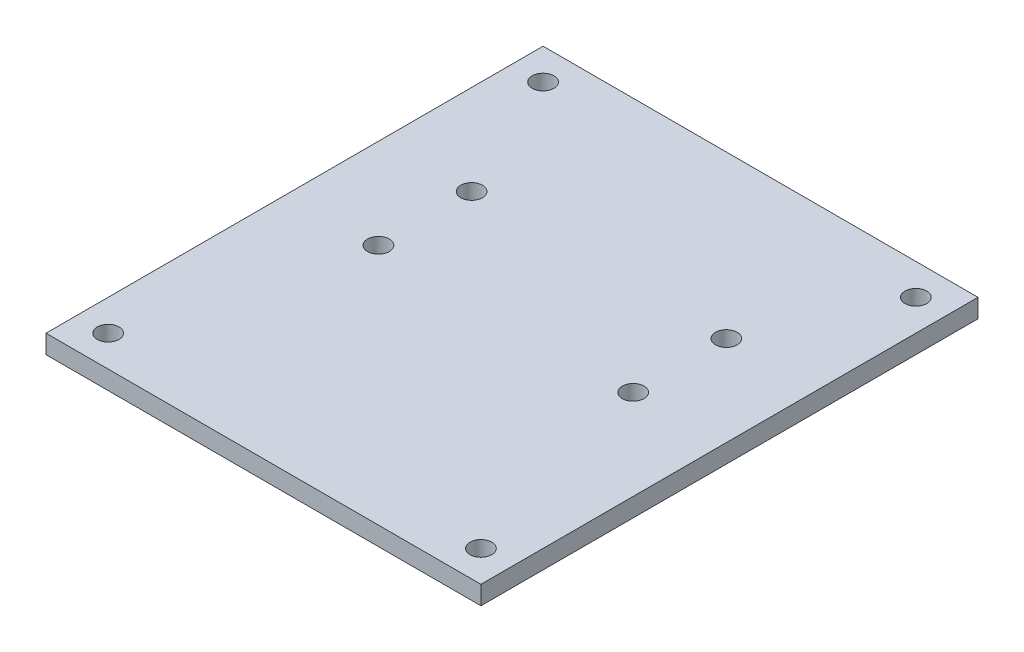
ISO-10303-21;
HEADER;
FILE_DESCRIPTION(('STEP AP214'),'2;1');
FILE_NAME('part.step','',(''),(''),'','','');
FILE_SCHEMA(('AUTOMOTIVE_DESIGN { 1 0 10303 214 1 1 1 1 }'));
ENDSEC;
DATA;
#1=APPLICATION_CONTEXT('core data for automotive mechanical design processes');
#2=APPLICATION_PROTOCOL_DEFINITION('international standard','automotive_design',2000,#1);
#3=PRODUCT_CONTEXT('',#1,'mechanical');
#4=PRODUCT('Part','Part','',(#3));
#5=PRODUCT_RELATED_PRODUCT_CATEGORY('part','',(#4));
#6=PRODUCT_DEFINITION_FORMATION('','',#4);
#7=PRODUCT_DEFINITION_CONTEXT('part definition',#1,'design');
#8=PRODUCT_DEFINITION('design','',#6,#7);
#9=PRODUCT_DEFINITION_SHAPE('','',#8);
#10=(LENGTH_UNIT() NAMED_UNIT(*) SI_UNIT(.MILLI.,.METRE.));
#11=(NAMED_UNIT(*) PLANE_ANGLE_UNIT() SI_UNIT($,.RADIAN.));
#12=(NAMED_UNIT(*) SI_UNIT($,.STERADIAN.) SOLID_ANGLE_UNIT());
#13=UNCERTAINTY_MEASURE_WITH_UNIT(LENGTH_MEASURE(1.E-05),#10,'distance_accuracy_value','');
#14=(GEOMETRIC_REPRESENTATION_CONTEXT(3) GLOBAL_UNCERTAINTY_ASSIGNED_CONTEXT((#13)) GLOBAL_UNIT_ASSIGNED_CONTEXT((#10,
#11,#12)) REPRESENTATION_CONTEXT('',''));
#15=CARTESIAN_POINT('',(0.,0.,0.));
#16=DIRECTION('',(0.,0.,1.));
#17=DIRECTION('',(1.,0.,0.));
#18=AXIS2_PLACEMENT_3D('',#15,#16,#17);
#19=CARTESIAN_POINT('',(0.,3.,0.));
#20=DIRECTION('',(0.,-1.,0.));
#21=DIRECTION('',(0.,0.,-1.));
#22=AXIS2_PLACEMENT_3D('',#19,#20,#21);
#23=PLANE('',#22);
#24=CARTESIAN_POINT('',(-30.0000000000001,3.,-28.5000000000004));
#25=DIRECTION('',(0.,1.,0.));
#26=DIRECTION('',(0.,0.,-1.));
#27=AXIS2_PLACEMENT_3D('',#24,#25,#26);
#28=CIRCLE('',#27,1.75000000000001);
#29=CARTESIAN_POINT('',(-30.0000000000001,3.,-30.2500000000004));
#30=VERTEX_POINT('',#29);
#31=EDGE_CURVE('E154',#30,#30,#28,.T.);
#32=ORIENTED_EDGE('',*,*,#31,.F.);
#33=EDGE_LOOP('',(#32));
#34=FACE_BOUND('',#33,.T.);
#35=CARTESIAN_POINT('',(30.,3.,41.5));
#36=DIRECTION('',(0.,1.,0.));
#37=DIRECTION('',(0.,0.,-1.));
#38=AXIS2_PLACEMENT_3D('',#35,#36,#37);
#39=CIRCLE('',#38,1.75000000000001);
#40=CARTESIAN_POINT('',(30.,3.,39.75));
#41=VERTEX_POINT('',#40);
#42=EDGE_CURVE('E147',#41,#41,#39,.T.);
#43=ORIENTED_EDGE('',*,*,#42,.F.);
#44=EDGE_LOOP('',(#43));
#45=FACE_BOUND('',#44,.T.);
#46=CARTESIAN_POINT('',(-30.0000000000001,3.,41.5000000000004));
#47=DIRECTION('',(0.,1.,0.));
#48=DIRECTION('',(0.,0.,1.));
#49=AXIS2_PLACEMENT_3D('',#46,#47,#48);
#50=CIRCLE('',#49,1.75000000000001);
#51=CARTESIAN_POINT('',(-30.0000000000001,3.,43.2500000000004));
#52=VERTEX_POINT('',#51);
#53=EDGE_CURVE('E159',#52,#52,#50,.T.);
#54=ORIENTED_EDGE('',*,*,#53,.F.);
#55=EDGE_LOOP('',(#54));
#56=FACE_BOUND('',#55,.T.);
#57=CARTESIAN_POINT('',(30.,3.,-28.5));
#58=DIRECTION('',(0.,1.,0.));
#59=DIRECTION('',(0.,0.,1.));
#60=AXIS2_PLACEMENT_3D('',#57,#58,#59);
#61=CIRCLE('',#60,1.75000000000001);
#62=CARTESIAN_POINT('',(30.,3.,-26.75));
#63=VERTEX_POINT('',#62);
#64=EDGE_CURVE('E141',#63,#63,#61,.T.);
#65=ORIENTED_EDGE('',*,*,#64,.F.);
#66=EDGE_LOOP('',(#65));
#67=FACE_BOUND('',#66,.T.);
#68=DIRECTION('',(0.,0.,-1.));
#69=VECTOR('',#68,1.);
#70=CARTESIAN_POINT('',(35.,3.,46.5));
#71=LINE('',#70,#69);
#72=CARTESIAN_POINT('',(35.,3.,46.5));
#73=VERTEX_POINT('',#72);
#74=CARTESIAN_POINT('',(35.,3.,-33.5));
#75=VERTEX_POINT('',#74);
#76=EDGE_CURVE('E90',#73,#75,#71,.T.);
#77=ORIENTED_EDGE('',*,*,#76,.T.);
#78=DIRECTION('',(-1.,0.,0.));
#79=VECTOR('',#78,1.);
#80=CARTESIAN_POINT('',(-35.,3.,-33.5));
#81=LINE('',#80,#79);
#82=CARTESIAN_POINT('',(-35.,3.,-33.5));
#83=VERTEX_POINT('',#82);
#84=EDGE_CURVE('E85',#75,#83,#81,.T.);
#85=ORIENTED_EDGE('',*,*,#84,.T.);
#86=DIRECTION('',(0.,0.,1.));
#87=VECTOR('',#86,1.);
#88=CARTESIAN_POINT('',(-35.,3.,46.5));
#89=LINE('',#88,#87);
#90=CARTESIAN_POINT('',(-35.,3.,46.5));
#91=VERTEX_POINT('',#90);
#92=EDGE_CURVE('E88',#83,#91,#89,.T.);
#93=ORIENTED_EDGE('',*,*,#92,.T.);
#94=DIRECTION('',(1.,0.,0.));
#95=VECTOR('',#94,1.);
#96=CARTESIAN_POINT('',(-35.,3.,46.5));
#97=LINE('',#96,#95);
#98=EDGE_CURVE('E55',#91,#73,#97,.T.);
#99=ORIENTED_EDGE('',*,*,#98,.T.);
#100=EDGE_LOOP('',(#77,#85,#93,#99));
#101=FACE_BOUND('',#100,.T.);
#102=CARTESIAN_POINT('',(-20.5,3.,-7.5));
#103=DIRECTION('',(0.,1.,0.));
#104=DIRECTION('',(0.,0.,1.));
#105=AXIS2_PLACEMENT_3D('',#102,#103,#104);
#106=CIRCLE('',#105,1.75);
#107=CARTESIAN_POINT('',(-20.5,3.,-5.75));
#108=VERTEX_POINT('',#107);
#109=EDGE_CURVE('E105',#108,#108,#106,.T.);
#110=ORIENTED_EDGE('',*,*,#109,.F.);
#111=EDGE_LOOP('',(#110));
#112=FACE_BOUND('',#111,.T.);
#113=CARTESIAN_POINT('',(-20.5,3.,7.5));
#114=DIRECTION('',(0.,1.,0.));
#115=DIRECTION('',(0.,0.,-1.));
#116=AXIS2_PLACEMENT_3D('',#113,#114,#115);
#117=CIRCLE('',#116,1.75);
#118=CARTESIAN_POINT('',(-20.5,3.,5.75));
#119=VERTEX_POINT('',#118);
#120=EDGE_CURVE('E120',#119,#119,#117,.T.);
#121=ORIENTED_EDGE('',*,*,#120,.F.);
#122=EDGE_LOOP('',(#121));
#123=FACE_BOUND('',#122,.T.);
#124=CARTESIAN_POINT('',(20.5,3.,7.49999999999997));
#125=DIRECTION('',(0.,1.,0.));
#126=DIRECTION('',(0.,0.,1.));
#127=AXIS2_PLACEMENT_3D('',#124,#125,#126);
#128=CIRCLE('',#127,1.75);
#129=CARTESIAN_POINT('',(20.5,3.,9.24999999999997));
#130=VERTEX_POINT('',#129);
#131=EDGE_CURVE('E126',#130,#130,#128,.T.);
#132=ORIENTED_EDGE('',*,*,#131,.F.);
#133=EDGE_LOOP('',(#132));
#134=FACE_BOUND('',#133,.T.);
#135=CARTESIAN_POINT('',(20.5,3.,-7.50000000000003));
#136=DIRECTION('',(0.,1.,0.));
#137=DIRECTION('',(0.,0.,-1.));
#138=AXIS2_PLACEMENT_3D('',#135,#136,#137);
#139=CIRCLE('',#138,1.75);
#140=CARTESIAN_POINT('',(20.5,3.,-9.25000000000003));
#141=VERTEX_POINT('',#140);
#142=EDGE_CURVE('E132',#141,#141,#139,.T.);
#143=ORIENTED_EDGE('',*,*,#142,.F.);
#144=EDGE_LOOP('',(#143));
#145=FACE_BOUND('',#144,.T.);
#146=ADVANCED_FACE('F38',(#34,#45,#56,#67,#101,#112,#123,#134,#145),#23,.F.);
#147=CARTESIAN_POINT('',(0.,0.,0.));
#148=DIRECTION('',(0.,-1.,0.));
#149=DIRECTION('',(0.,0.,-1.));
#150=AXIS2_PLACEMENT_3D('',#147,#148,#149);
#151=PLANE('',#150);
#152=CARTESIAN_POINT('',(-30.0000000000001,0.,-28.5000000000004));
#153=DIRECTION('',(0.,1.,0.));
#154=DIRECTION('',(0.,0.,-1.));
#155=AXIS2_PLACEMENT_3D('',#152,#153,#154);
#156=CIRCLE('',#155,1.75000000000001);
#157=CARTESIAN_POINT('',(-30.0000000000001,0.,-30.2500000000004));
#158=VERTEX_POINT('',#157);
#159=EDGE_CURVE('E144',#158,#158,#156,.T.);
#160=ORIENTED_EDGE('',*,*,#159,.T.);
#161=EDGE_LOOP('',(#160));
#162=FACE_BOUND('',#161,.T.);
#163=CARTESIAN_POINT('',(30.,0.,41.5));
#164=DIRECTION('',(0.,1.,0.));
#165=DIRECTION('',(0.,0.,-1.));
#166=AXIS2_PLACEMENT_3D('',#163,#164,#165);
#167=CIRCLE('',#166,1.75000000000001);
#168=CARTESIAN_POINT('',(30.,0.,39.75));
#169=VERTEX_POINT('',#168);
#170=EDGE_CURVE('E150',#169,#169,#167,.T.);
#171=ORIENTED_EDGE('',*,*,#170,.T.);
#172=EDGE_LOOP('',(#171));
#173=FACE_BOUND('',#172,.T.);
#174=CARTESIAN_POINT('',(-30.0000000000001,0.,41.5000000000004));
#175=DIRECTION('',(0.,1.,0.));
#176=DIRECTION('',(0.,0.,1.));
#177=AXIS2_PLACEMENT_3D('',#174,#175,#176);
#178=CIRCLE('',#177,1.75000000000001);
#179=CARTESIAN_POINT('',(-30.0000000000001,0.,43.2500000000004));
#180=VERTEX_POINT('',#179);
#181=EDGE_CURVE('E151',#180,#180,#178,.T.);
#182=ORIENTED_EDGE('',*,*,#181,.T.);
#183=EDGE_LOOP('',(#182));
#184=FACE_BOUND('',#183,.T.);
#185=CARTESIAN_POINT('',(30.,0.,-28.5));
#186=DIRECTION('',(0.,1.,0.));
#187=DIRECTION('',(0.,0.,1.));
#188=AXIS2_PLACEMENT_3D('',#185,#186,#187);
#189=CIRCLE('',#188,1.75000000000001);
#190=CARTESIAN_POINT('',(30.,0.,-26.75));
#191=VERTEX_POINT('',#190);
#192=EDGE_CURVE('E138',#191,#191,#189,.T.);
#193=ORIENTED_EDGE('',*,*,#192,.T.);
#194=EDGE_LOOP('',(#193));
#195=FACE_BOUND('',#194,.T.);
#196=CARTESIAN_POINT('',(20.5,0.,7.49999999999997));
#197=DIRECTION('',(0.,1.,0.));
#198=DIRECTION('',(0.,0.,1.));
#199=AXIS2_PLACEMENT_3D('',#196,#197,#198);
#200=CIRCLE('',#199,1.75);
#201=CARTESIAN_POINT('',(20.5,0.,9.24999999999997));
#202=VERTEX_POINT('',#201);
#203=EDGE_CURVE('E129',#202,#202,#200,.T.);
#204=ORIENTED_EDGE('',*,*,#203,.T.);
#205=EDGE_LOOP('',(#204));
#206=FACE_BOUND('',#205,.T.);
#207=CARTESIAN_POINT('',(-20.5,0.,-7.5));
#208=DIRECTION('',(0.,1.,0.));
#209=DIRECTION('',(0.,0.,1.));
#210=AXIS2_PLACEMENT_3D('',#207,#208,#209);
#211=CIRCLE('',#210,1.75);
#212=CARTESIAN_POINT('',(-20.5,0.,-5.75));
#213=VERTEX_POINT('',#212);
#214=EDGE_CURVE('E117',#213,#213,#211,.T.);
#215=ORIENTED_EDGE('',*,*,#214,.T.);
#216=EDGE_LOOP('',(#215));
#217=FACE_BOUND('',#216,.T.);
#218=DIRECTION('',(0.,0.,-1.));
#219=VECTOR('',#218,1.);
#220=CARTESIAN_POINT('',(35.,0.,46.5));
#221=LINE('',#220,#219);
#222=CARTESIAN_POINT('',(35.,0.,46.5));
#223=VERTEX_POINT('',#222);
#224=CARTESIAN_POINT('',(35.,0.,-33.5));
#225=VERTEX_POINT('',#224);
#226=EDGE_CURVE('E102',#223,#225,#221,.T.);
#227=ORIENTED_EDGE('',*,*,#226,.F.);
#228=DIRECTION('',(1.,0.,0.));
#229=VECTOR('',#228,1.);
#230=CARTESIAN_POINT('',(-35.,0.,46.5));
#231=LINE('',#230,#229);
#232=CARTESIAN_POINT('',(-35.,0.,46.5));
#233=VERTEX_POINT('',#232);
#234=EDGE_CURVE('E78',#233,#223,#231,.T.);
#235=ORIENTED_EDGE('',*,*,#234,.F.);
#236=DIRECTION('',(0.,0.,1.));
#237=VECTOR('',#236,1.);
#238=CARTESIAN_POINT('',(-35.,0.,46.5));
#239=LINE('',#238,#237);
#240=CARTESIAN_POINT('',(-35.,0.,-33.5));
#241=VERTEX_POINT('',#240);
#242=EDGE_CURVE('E72',#241,#233,#239,.T.);
#243=ORIENTED_EDGE('',*,*,#242,.F.);
#244=DIRECTION('',(-1.,0.,0.));
#245=VECTOR('',#244,1.);
#246=CARTESIAN_POINT('',(-35.,0.,-33.5));
#247=LINE('',#246,#245);
#248=EDGE_CURVE('E94',#225,#241,#247,.T.);
#249=ORIENTED_EDGE('',*,*,#248,.F.);
#250=EDGE_LOOP('',(#227,#235,#243,#249));
#251=FACE_BOUND('',#250,.T.);
#252=CARTESIAN_POINT('',(-20.5,0.,7.5));
#253=DIRECTION('',(0.,1.,0.));
#254=DIRECTION('',(0.,0.,-1.));
#255=AXIS2_PLACEMENT_3D('',#252,#253,#254);
#256=CIRCLE('',#255,1.75);
#257=CARTESIAN_POINT('',(-20.5,0.,5.75));
#258=VERTEX_POINT('',#257);
#259=EDGE_CURVE('E123',#258,#258,#256,.T.);
#260=ORIENTED_EDGE('',*,*,#259,.T.);
#261=EDGE_LOOP('',(#260));
#262=FACE_BOUND('',#261,.T.);
#263=CARTESIAN_POINT('',(20.5,0.,-7.50000000000003));
#264=DIRECTION('',(0.,1.,0.));
#265=DIRECTION('',(0.,0.,-1.));
#266=AXIS2_PLACEMENT_3D('',#263,#264,#265);
#267=CIRCLE('',#266,1.75);
#268=CARTESIAN_POINT('',(20.5,0.,-9.25000000000003));
#269=VERTEX_POINT('',#268);
#270=EDGE_CURVE('E135',#269,#269,#267,.T.);
#271=ORIENTED_EDGE('',*,*,#270,.T.);
#272=EDGE_LOOP('',(#271));
#273=FACE_BOUND('',#272,.T.);
#274=ADVANCED_FACE('F113',(#162,#173,#184,#195,#206,#217,#251,#262,#273),#151,.T.);
#275=CARTESIAN_POINT('',(35.,3.,46.5));
#276=DIRECTION('',(-1.,0.,0.));
#277=DIRECTION('',(0.,0.,1.));
#278=AXIS2_PLACEMENT_3D('',#275,#276,#277);
#279=PLANE('',#278);
#280=ORIENTED_EDGE('',*,*,#226,.T.);
#281=DIRECTION('',(0.,-1.,0.));
#282=VECTOR('',#281,1.);
#283=CARTESIAN_POINT('',(35.,3.,-33.5));
#284=LINE('',#283,#282);
#285=EDGE_CURVE('E11',#75,#225,#284,.T.);
#286=ORIENTED_EDGE('',*,*,#285,.F.);
#287=ORIENTED_EDGE('',*,*,#76,.F.);
#288=DIRECTION('',(0.,-1.,0.));
#289=VECTOR('',#288,1.);
#290=CARTESIAN_POINT('',(35.,3.,46.5));
#291=LINE('',#290,#289);
#292=EDGE_CURVE('E98',#73,#223,#291,.T.);
#293=ORIENTED_EDGE('',*,*,#292,.T.);
#294=EDGE_LOOP('',(#280,#286,#287,#293));
#295=FACE_BOUND('',#294,.T.);
#296=ADVANCED_FACE('F40',(#295),#279,.F.);
#297=CARTESIAN_POINT('',(-35.,3.,-33.5));
#298=DIRECTION('',(0.,0.,1.));
#299=DIRECTION('',(1.,0.,0.));
#300=AXIS2_PLACEMENT_3D('',#297,#298,#299);
#301=PLANE('',#300);
#302=ORIENTED_EDGE('',*,*,#248,.T.);
#303=DIRECTION('',(0.,-1.,0.));
#304=VECTOR('',#303,1.);
#305=CARTESIAN_POINT('',(-35.,3.,-33.5));
#306=LINE('',#305,#304);
#307=EDGE_CURVE('E47',#83,#241,#306,.T.);
#308=ORIENTED_EDGE('',*,*,#307,.F.);
#309=ORIENTED_EDGE('',*,*,#84,.F.);
#310=ORIENTED_EDGE('',*,*,#285,.T.);
#311=EDGE_LOOP('',(#302,#308,#309,#310));
#312=FACE_BOUND('',#311,.T.);
#313=ADVANCED_FACE('F93',(#312),#301,.F.);
#314=CARTESIAN_POINT('',(-35.,3.,46.5));
#315=DIRECTION('',(1.,0.,0.));
#316=DIRECTION('',(0.,0.,-1.));
#317=AXIS2_PLACEMENT_3D('',#314,#315,#316);
#318=PLANE('',#317);
#319=ORIENTED_EDGE('',*,*,#242,.T.);
#320=DIRECTION('',(0.,-1.,0.));
#321=VECTOR('',#320,1.);
#322=CARTESIAN_POINT('',(-35.,3.,46.5));
#323=LINE('',#322,#321);
#324=EDGE_CURVE('E95',#91,#233,#323,.T.);
#325=ORIENTED_EDGE('',*,*,#324,.F.);
#326=ORIENTED_EDGE('',*,*,#92,.F.);
#327=ORIENTED_EDGE('',*,*,#307,.T.);
#328=EDGE_LOOP('',(#319,#325,#326,#327));
#329=FACE_BOUND('',#328,.T.);
#330=ADVANCED_FACE('F96',(#329),#318,.F.);
#331=CARTESIAN_POINT('',(-35.,3.,46.5));
#332=DIRECTION('',(0.,0.,-1.));
#333=DIRECTION('',(-1.,0.,0.));
#334=AXIS2_PLACEMENT_3D('',#331,#332,#333);
#335=PLANE('',#334);
#336=ORIENTED_EDGE('',*,*,#234,.T.);
#337=ORIENTED_EDGE('',*,*,#292,.F.);
#338=ORIENTED_EDGE('',*,*,#98,.F.);
#339=ORIENTED_EDGE('',*,*,#324,.T.);
#340=EDGE_LOOP('',(#336,#337,#338,#339));
#341=FACE_BOUND('',#340,.T.);
#342=ADVANCED_FACE('F110',(#341),#335,.F.);
#343=CARTESIAN_POINT('',(-20.5,3.,-7.5));
#344=DIRECTION('',(0.,-1.,0.));
#345=DIRECTION('',(0.,0.,-1.));
#346=AXIS2_PLACEMENT_3D('',#343,#344,#345);
#347=CYLINDRICAL_SURFACE('',#346,1.75);
#348=ORIENTED_EDGE('',*,*,#109,.T.);
#349=EDGE_LOOP('',(#348));
#350=FACE_BOUND('',#349,.T.);
#351=ORIENTED_EDGE('',*,*,#214,.F.);
#352=EDGE_LOOP('',(#351));
#353=FACE_BOUND('',#352,.T.);
#354=ADVANCED_FACE('F201',(#350,#353),#347,.F.);
#355=CARTESIAN_POINT('',(-20.5,3.,7.5));
#356=DIRECTION('',(0.,-1.,0.));
#357=DIRECTION('',(0.,0.,-1.));
#358=AXIS2_PLACEMENT_3D('',#355,#356,#357);
#359=CYLINDRICAL_SURFACE('',#358,1.75);
#360=ORIENTED_EDGE('',*,*,#120,.T.);
#361=EDGE_LOOP('',(#360));
#362=FACE_BOUND('',#361,.T.);
#363=ORIENTED_EDGE('',*,*,#259,.F.);
#364=EDGE_LOOP('',(#363));
#365=FACE_BOUND('',#364,.T.);
#366=ADVANCED_FACE('F197',(#362,#365),#359,.F.);
#367=CARTESIAN_POINT('',(20.5,3.,7.49999999999997));
#368=DIRECTION('',(0.,-1.,0.));
#369=DIRECTION('',(0.,0.,-1.));
#370=AXIS2_PLACEMENT_3D('',#367,#368,#369);
#371=CYLINDRICAL_SURFACE('',#370,1.75);
#372=ORIENTED_EDGE('',*,*,#131,.T.);
#373=EDGE_LOOP('',(#372));
#374=FACE_BOUND('',#373,.T.);
#375=ORIENTED_EDGE('',*,*,#203,.F.);
#376=EDGE_LOOP('',(#375));
#377=FACE_BOUND('',#376,.T.);
#378=ADVANCED_FACE('F188',(#374,#377),#371,.F.);
#379=CARTESIAN_POINT('',(20.5,3.,-7.50000000000003));
#380=DIRECTION('',(0.,-1.,0.));
#381=DIRECTION('',(0.,0.,-1.));
#382=AXIS2_PLACEMENT_3D('',#379,#380,#381);
#383=CYLINDRICAL_SURFACE('',#382,1.75);
#384=ORIENTED_EDGE('',*,*,#142,.T.);
#385=EDGE_LOOP('',(#384));
#386=FACE_BOUND('',#385,.T.);
#387=ORIENTED_EDGE('',*,*,#270,.F.);
#388=EDGE_LOOP('',(#387));
#389=FACE_BOUND('',#388,.T.);
#390=ADVANCED_FACE('F182',(#386,#389),#383,.F.);
#391=CARTESIAN_POINT('',(30.,0.,-28.5));
#392=DIRECTION('',(0.,1.,0.));
#393=DIRECTION('',(0.,0.,1.));
#394=AXIS2_PLACEMENT_3D('',#391,#392,#393);
#395=CYLINDRICAL_SURFACE('',#394,1.75000000000001);
#396=ORIENTED_EDGE('',*,*,#192,.F.);
#397=EDGE_LOOP('',(#396));
#398=FACE_BOUND('',#397,.T.);
#399=ORIENTED_EDGE('',*,*,#64,.T.);
#400=EDGE_LOOP('',(#399));
#401=FACE_BOUND('',#400,.T.);
#402=ADVANCED_FACE('F171',(#398,#401),#395,.F.);
#403=CARTESIAN_POINT('',(-30.0000000000001,0.,41.5000000000004));
#404=DIRECTION('',(0.,1.,0.));
#405=DIRECTION('',(0.,0.,1.));
#406=AXIS2_PLACEMENT_3D('',#403,#404,#405);
#407=CYLINDRICAL_SURFACE('',#406,1.75000000000001);
#408=ORIENTED_EDGE('',*,*,#181,.F.);
#409=EDGE_LOOP('',(#408));
#410=FACE_BOUND('',#409,.T.);
#411=ORIENTED_EDGE('',*,*,#53,.T.);
#412=EDGE_LOOP('',(#411));
#413=FACE_BOUND('',#412,.T.);
#414=ADVANCED_FACE('F167',(#410,#413),#407,.F.);
#415=CARTESIAN_POINT('',(30.,0.,41.5));
#416=DIRECTION('',(0.,1.,0.));
#417=DIRECTION('',(0.,0.,1.));
#418=AXIS2_PLACEMENT_3D('',#415,#416,#417);
#419=CYLINDRICAL_SURFACE('',#418,1.75000000000001);
#420=ORIENTED_EDGE('',*,*,#170,.F.);
#421=EDGE_LOOP('',(#420));
#422=FACE_BOUND('',#421,.T.);
#423=ORIENTED_EDGE('',*,*,#42,.T.);
#424=EDGE_LOOP('',(#423));
#425=FACE_BOUND('',#424,.T.);
#426=ADVANCED_FACE('F170',(#422,#425),#419,.F.);
#427=CARTESIAN_POINT('',(-30.0000000000001,0.,-28.5000000000004));
#428=DIRECTION('',(0.,1.,0.));
#429=DIRECTION('',(0.,0.,1.));
#430=AXIS2_PLACEMENT_3D('',#427,#428,#429);
#431=CYLINDRICAL_SURFACE('',#430,1.75000000000001);
#432=ORIENTED_EDGE('',*,*,#159,.F.);
#433=EDGE_LOOP('',(#432));
#434=FACE_BOUND('',#433,.T.);
#435=ORIENTED_EDGE('',*,*,#31,.T.);
#436=EDGE_LOOP('',(#435));
#437=FACE_BOUND('',#436,.T.);
#438=ADVANCED_FACE('F289',(#434,#437),#431,.F.);
#439=CLOSED_SHELL('',(#146,#274,#296,#313,#330,#342,#354,#366,#378,#390,#402,#414,#426,#438));
#440=MANIFOLD_SOLID_BREP('B2',#439);
#441=ADVANCED_BREP_SHAPE_REPRESENTATION('',(#18,#440),#14);
#442=SHAPE_DEFINITION_REPRESENTATION(#9,#441);
ENDSEC;
END-ISO-10303-21;
